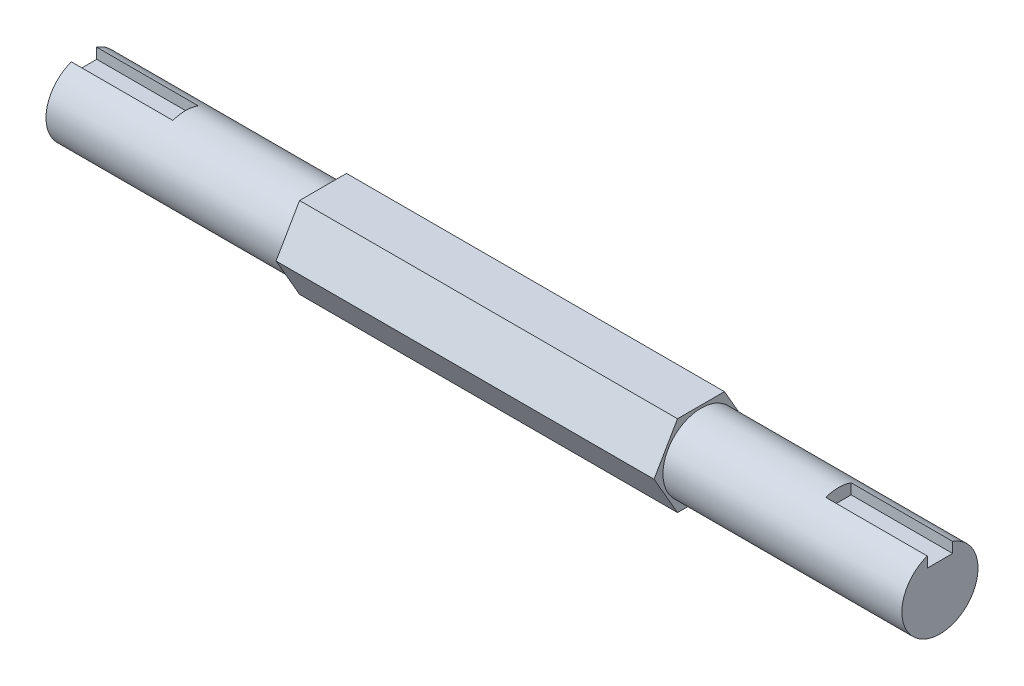
ISO-10303-21;
HEADER;
FILE_DESCRIPTION(('STEP AP214'),'2;1');
FILE_NAME('part.step','',(''),(''),'','','');
FILE_SCHEMA(('AUTOMOTIVE_DESIGN { 1 0 10303 214 1 1 1 1 }'));
ENDSEC;
DATA;
#1=APPLICATION_CONTEXT('core data for automotive mechanical design processes');
#2=APPLICATION_PROTOCOL_DEFINITION('international standard','automotive_design',2000,#1);
#3=PRODUCT_CONTEXT('',#1,'mechanical');
#4=PRODUCT('Part','Part','',(#3));
#5=PRODUCT_RELATED_PRODUCT_CATEGORY('part','',(#4));
#6=PRODUCT_DEFINITION_FORMATION('','',#4);
#7=PRODUCT_DEFINITION_CONTEXT('part definition',#1,'design');
#8=PRODUCT_DEFINITION('design','',#6,#7);
#9=PRODUCT_DEFINITION_SHAPE('','',#8);
#10=(LENGTH_UNIT() NAMED_UNIT(*) SI_UNIT(.MILLI.,.METRE.));
#11=(NAMED_UNIT(*) PLANE_ANGLE_UNIT() SI_UNIT($,.RADIAN.));
#12=(NAMED_UNIT(*) SI_UNIT($,.STERADIAN.) SOLID_ANGLE_UNIT());
#13=UNCERTAINTY_MEASURE_WITH_UNIT(LENGTH_MEASURE(1.E-05),#10,'distance_accuracy_value','');
#14=(GEOMETRIC_REPRESENTATION_CONTEXT(3) GLOBAL_UNCERTAINTY_ASSIGNED_CONTEXT((#13)) GLOBAL_UNIT_ASSIGNED_CONTEXT((#10,
#11,#12)) REPRESENTATION_CONTEXT('',''));
#15=CARTESIAN_POINT('',(0.,0.,0.));
#16=DIRECTION('',(0.,0.,1.));
#17=DIRECTION('',(1.,0.,0.));
#18=AXIS2_PLACEMENT_3D('',#15,#16,#17);
#19=CARTESIAN_POINT('',(-168.7,0.,0.));
#20=DIRECTION('',(1.,0.,0.));
#21=DIRECTION('',(0.,0.,-1.));
#22=AXIS2_PLACEMENT_3D('',#19,#20,#21);
#23=PLANE('',#22);
#24=DIRECTION('',(0.,1.,0.));
#25=VECTOR('',#24,1.);
#26=CARTESIAN_POINT('',(-168.7,10.,-5.));
#27=LINE('',#26,#25);
#28=CARTESIAN_POINT('',(-168.7,10.,-5.));
#29=VERTEX_POINT('',#28);
#30=CARTESIAN_POINT('',(-168.7,14.142135623731,-5.));
#31=VERTEX_POINT('',#30);
#32=EDGE_CURVE('E148',#29,#31,#27,.T.);
#33=ORIENTED_EDGE('',*,*,#32,.T.);
#34=CARTESIAN_POINT('',(-168.7,0.,0.));
#35=DIRECTION('',(1.,0.,0.));
#36=DIRECTION('',(0.,0.,-1.));
#37=AXIS2_PLACEMENT_3D('',#34,#35,#36);
#38=CIRCLE('',#37,15.);
#39=CARTESIAN_POINT('',(-168.7,14.142135623731,5.));
#40=VERTEX_POINT('',#39);
#41=EDGE_CURVE('E235',#40,#31,#38,.T.);
#42=ORIENTED_EDGE('',*,*,#41,.F.);
#43=DIRECTION('',(0.,-1.,0.));
#44=VECTOR('',#43,1.);
#45=CARTESIAN_POINT('',(-168.7,10.,5.));
#46=LINE('',#45,#44);
#47=CARTESIAN_POINT('',(-168.7,10.,5.));
#48=VERTEX_POINT('',#47);
#49=EDGE_CURVE('E154',#40,#48,#46,.T.);
#50=ORIENTED_EDGE('',*,*,#49,.T.);
#51=DIRECTION('',(0.,0.,-1.));
#52=VECTOR('',#51,1.);
#53=CARTESIAN_POINT('',(-168.7,10.,5.));
#54=LINE('',#53,#52);
#55=EDGE_CURVE('E157',#48,#29,#54,.T.);
#56=ORIENTED_EDGE('',*,*,#55,.T.);
#57=EDGE_LOOP('',(#33,#42,#50,#56));
#58=FACE_BOUND('',#57,.T.);
#59=ADVANCED_FACE('F33',(#58),#23,.F.);
#60=CARTESIAN_POINT('',(168.7,0.,0.));
#61=DIRECTION('',(-1.,0.,0.));
#62=DIRECTION('',(0.,0.,1.));
#63=AXIS2_PLACEMENT_3D('',#60,#61,#62);
#64=CYLINDRICAL_SURFACE('',#63,15.);
#65=CARTESIAN_POINT('',(-74.5,0.,0.));
#66=DIRECTION('',(1.,0.,0.));
#67=DIRECTION('',(0.,0.,-1.));
#68=AXIS2_PLACEMENT_3D('',#65,#66,#67);
#69=CIRCLE('',#68,15.);
#70=CARTESIAN_POINT('',(-74.5,0.,-15.));
#71=VERTEX_POINT('',#70);
#72=EDGE_CURVE('E234',#71,#71,#69,.T.);
#73=ORIENTED_EDGE('',*,*,#72,.F.);
#74=EDGE_LOOP('',(#73));
#75=FACE_BOUND('',#74,.T.);
#76=DIRECTION('',(-1.,0.,0.));
#77=VECTOR('',#76,1.);
#78=CARTESIAN_POINT('',(168.7,14.142135623731,-5.));
#79=LINE('',#78,#77);
#80=CARTESIAN_POINT('',(-128.7,14.142135623731,-5.));
#81=VERTEX_POINT('',#80);
#82=EDGE_CURVE('E11',#81,#31,#79,.T.);
#83=ORIENTED_EDGE('',*,*,#82,.F.);
#84=CARTESIAN_POINT('',(-128.7,0.,0.));
#85=DIRECTION('',(1.,0.,0.));
#86=DIRECTION('',(0.,0.,-1.));
#87=AXIS2_PLACEMENT_3D('',#84,#85,#86);
#88=CIRCLE('',#87,15.);
#89=CARTESIAN_POINT('',(-128.7,14.142135623731,5.));
#90=VERTEX_POINT('',#89);
#91=EDGE_CURVE('E153',#81,#90,#88,.T.);
#92=ORIENTED_EDGE('',*,*,#91,.T.);
#93=DIRECTION('',(-1.,0.,0.));
#94=VECTOR('',#93,1.);
#95=CARTESIAN_POINT('',(168.7,14.142135623731,5.));
#96=LINE('',#95,#94);
#97=EDGE_CURVE('E41',#40,#90,#96,.F.);
#98=ORIENTED_EDGE('',*,*,#97,.F.);
#99=ORIENTED_EDGE('',*,*,#41,.T.);
#100=EDGE_LOOP('',(#83,#92,#98,#99));
#101=FACE_BOUND('',#100,.T.);
#102=ADVANCED_FACE('F252',(#75,#101),#64,.T.);
#103=CARTESIAN_POINT('',(74.5,0.,0.));
#104=DIRECTION('',(1.,0.,0.));
#105=DIRECTION('',(0.,0.,-1.));
#106=AXIS2_PLACEMENT_3D('',#103,#104,#105);
#107=CIRCLE('',#106,15.);
#108=CARTESIAN_POINT('',(74.5,0.,-15.));
#109=VERTEX_POINT('',#108);
#110=EDGE_CURVE('E230',#109,#109,#107,.T.);
#111=ORIENTED_EDGE('',*,*,#110,.T.);
#112=EDGE_LOOP('',(#111));
#113=FACE_BOUND('',#112,.T.);
#114=CARTESIAN_POINT('',(128.7,0.,0.));
#115=DIRECTION('',(-1.,0.,0.));
#116=DIRECTION('',(0.,0.,1.));
#117=AXIS2_PLACEMENT_3D('',#114,#115,#116);
#118=CIRCLE('',#117,15.);
#119=CARTESIAN_POINT('',(128.7,14.142135623731,5.));
#120=VERTEX_POINT('',#119);
#121=CARTESIAN_POINT('',(128.7,14.142135623731,-5.));
#122=VERTEX_POINT('',#121);
#123=EDGE_CURVE('E244',#120,#122,#118,.T.);
#124=ORIENTED_EDGE('',*,*,#123,.T.);
#125=DIRECTION('',(-1.,0.,0.));
#126=VECTOR('',#125,1.);
#127=CARTESIAN_POINT('',(168.7,14.142135623731,-5.));
#128=LINE('',#127,#126);
#129=CARTESIAN_POINT('',(168.7,14.142135623731,-5.));
#130=VERTEX_POINT('',#129);
#131=EDGE_CURVE('E183',#122,#130,#128,.F.);
#132=ORIENTED_EDGE('',*,*,#131,.T.);
#133=CARTESIAN_POINT('',(168.7,0.,0.));
#134=DIRECTION('',(1.,0.,0.));
#135=DIRECTION('',(0.,0.,-1.));
#136=AXIS2_PLACEMENT_3D('',#133,#134,#135);
#137=CIRCLE('',#136,15.);
#138=CARTESIAN_POINT('',(168.7,14.142135623731,5.));
#139=VERTEX_POINT('',#138);
#140=EDGE_CURVE('E231',#139,#130,#137,.T.);
#141=ORIENTED_EDGE('',*,*,#140,.F.);
#142=DIRECTION('',(-1.,0.,0.));
#143=VECTOR('',#142,1.);
#144=CARTESIAN_POINT('',(168.7,14.142135623731,5.));
#145=LINE('',#144,#143);
#146=EDGE_CURVE('E56',#139,#120,#145,.T.);
#147=ORIENTED_EDGE('',*,*,#146,.T.);
#148=EDGE_LOOP('',(#124,#132,#141,#147));
#149=FACE_BOUND('',#148,.T.);
#150=ADVANCED_FACE('F35',(#113,#149),#64,.T.);
#151=CARTESIAN_POINT('',(168.7,0.,0.));
#152=DIRECTION('',(1.,0.,0.));
#153=DIRECTION('',(0.,0.,-1.));
#154=AXIS2_PLACEMENT_3D('',#151,#152,#153);
#155=PLANE('',#154);
#156=DIRECTION('',(0.,1.,0.));
#157=VECTOR('',#156,1.);
#158=CARTESIAN_POINT('',(168.7,10.,-5.));
#159=LINE('',#158,#157);
#160=CARTESIAN_POINT('',(168.7,10.,-5.));
#161=VERTEX_POINT('',#160);
#162=EDGE_CURVE('E163',#161,#130,#159,.T.);
#163=ORIENTED_EDGE('',*,*,#162,.F.);
#164=DIRECTION('',(0.,0.,-1.));
#165=VECTOR('',#164,1.);
#166=CARTESIAN_POINT('',(168.7,10.,5.));
#167=LINE('',#166,#165);
#168=CARTESIAN_POINT('',(168.7,10.,5.));
#169=VERTEX_POINT('',#168);
#170=EDGE_CURVE('E169',#169,#161,#167,.T.);
#171=ORIENTED_EDGE('',*,*,#170,.F.);
#172=DIRECTION('',(0.,-1.,0.));
#173=VECTOR('',#172,1.);
#174=CARTESIAN_POINT('',(168.7,0.,5.));
#175=LINE('',#174,#173);
#176=EDGE_CURVE('E240',#139,#169,#175,.T.);
#177=ORIENTED_EDGE('',*,*,#176,.F.);
#178=ORIENTED_EDGE('',*,*,#140,.T.);
#179=EDGE_LOOP('',(#163,#171,#177,#178));
#180=FACE_BOUND('',#179,.T.);
#181=ADVANCED_FACE('F260',(#180),#155,.T.);
#182=CARTESIAN_POINT('',(74.5,16.025,9.25203806376373));
#183=DIRECTION('',(0.,-0.5,-0.866025403784439));
#184=DIRECTION('',(0.,0.866025403784439,-0.5));
#185=AXIS2_PLACEMENT_3D('',#182,#183,#184);
#186=PLANE('',#185);
#187=DIRECTION('',(0.,-0.866025403784439,0.5));
#188=VECTOR('',#187,1.);
#189=CARTESIAN_POINT('',(-74.5,16.025,9.25203806376373));
#190=LINE('',#189,#188);
#191=CARTESIAN_POINT('',(-74.5,16.025,9.25203806376373));
#192=VERTEX_POINT('',#191);
#193=CARTESIAN_POINT('',(-74.5,0.,18.5040761275275));
#194=VERTEX_POINT('',#193);
#195=EDGE_CURVE('E186',#192,#194,#190,.T.);
#196=ORIENTED_EDGE('',*,*,#195,.T.);
#197=DIRECTION('',(-1.,0.,0.));
#198=VECTOR('',#197,1.);
#199=CARTESIAN_POINT('',(74.5,0.,18.5040761275275));
#200=LINE('',#199,#198);
#201=CARTESIAN_POINT('',(74.5,0.,18.5040761275275));
#202=VERTEX_POINT('',#201);
#203=EDGE_CURVE('E227',#202,#194,#200,.T.);
#204=ORIENTED_EDGE('',*,*,#203,.F.);
#205=DIRECTION('',(0.,-0.866025403784439,0.5));
#206=VECTOR('',#205,1.);
#207=CARTESIAN_POINT('',(74.5,16.025,9.25203806376373));
#208=LINE('',#207,#206);
#209=CARTESIAN_POINT('',(74.5,16.025,9.25203806376373));
#210=VERTEX_POINT('',#209);
#211=EDGE_CURVE('E187',#210,#202,#208,.T.);
#212=ORIENTED_EDGE('',*,*,#211,.F.);
#213=DIRECTION('',(-1.,0.,0.));
#214=VECTOR('',#213,1.);
#215=CARTESIAN_POINT('',(74.5,16.025,9.25203806376373));
#216=LINE('',#215,#214);
#217=EDGE_CURVE('E201',#210,#192,#216,.T.);
#218=ORIENTED_EDGE('',*,*,#217,.T.);
#219=EDGE_LOOP('',(#196,#204,#212,#218));
#220=FACE_BOUND('',#219,.T.);
#221=ADVANCED_FACE('F263',(#220),#186,.F.);
#222=CARTESIAN_POINT('',(74.5,0.,18.5040761275275));
#223=DIRECTION('',(0.,0.5,-0.866025403784439));
#224=DIRECTION('',(0.,0.866025403784439,0.5));
#225=AXIS2_PLACEMENT_3D('',#222,#223,#224);
#226=PLANE('',#225);
#227=DIRECTION('',(0.,-0.866025403784439,-0.5));
#228=VECTOR('',#227,1.);
#229=CARTESIAN_POINT('',(-74.5,0.,18.5040761275275));
#230=LINE('',#229,#228);
#231=CARTESIAN_POINT('',(-74.5,-16.025,9.25203806376375));
#232=VERTEX_POINT('',#231);
#233=EDGE_CURVE('E204',#194,#232,#230,.T.);
#234=ORIENTED_EDGE('',*,*,#233,.T.);
#235=DIRECTION('',(-1.,0.,0.));
#236=VECTOR('',#235,1.);
#237=CARTESIAN_POINT('',(74.5,-16.025,9.25203806376375));
#238=LINE('',#237,#236);
#239=CARTESIAN_POINT('',(74.5,-16.025,9.25203806376375));
#240=VERTEX_POINT('',#239);
#241=EDGE_CURVE('E224',#240,#232,#238,.T.);
#242=ORIENTED_EDGE('',*,*,#241,.F.);
#243=DIRECTION('',(0.,-0.866025403784439,-0.5));
#244=VECTOR('',#243,1.);
#245=CARTESIAN_POINT('',(74.5,0.,18.5040761275275));
#246=LINE('',#245,#244);
#247=EDGE_CURVE('E190',#202,#240,#246,.T.);
#248=ORIENTED_EDGE('',*,*,#247,.F.);
#249=ORIENTED_EDGE('',*,*,#203,.T.);
#250=EDGE_LOOP('',(#234,#242,#248,#249));
#251=FACE_BOUND('',#250,.T.);
#252=ADVANCED_FACE('F267',(#251),#226,.F.);
#253=CARTESIAN_POINT('',(74.5,-16.025,9.25203806376375));
#254=DIRECTION('',(0.,1.,0.));
#255=DIRECTION('',(0.,0.,1.));
#256=AXIS2_PLACEMENT_3D('',#253,#254,#255);
#257=PLANE('',#256);
#258=DIRECTION('',(0.,0.,-1.));
#259=VECTOR('',#258,1.);
#260=CARTESIAN_POINT('',(-74.5,-16.025,9.25203806376375));
#261=LINE('',#260,#259);
#262=CARTESIAN_POINT('',(-74.5,-16.025,-9.25203806376375));
#263=VERTEX_POINT('',#262);
#264=EDGE_CURVE('E206',#232,#263,#261,.T.);
#265=ORIENTED_EDGE('',*,*,#264,.T.);
#266=DIRECTION('',(-1.,0.,0.));
#267=VECTOR('',#266,1.);
#268=CARTESIAN_POINT('',(74.5,-16.025,-9.25203806376375));
#269=LINE('',#268,#267);
#270=CARTESIAN_POINT('',(74.5,-16.025,-9.25203806376375));
#271=VERTEX_POINT('',#270);
#272=EDGE_CURVE('E221',#271,#263,#269,.T.);
#273=ORIENTED_EDGE('',*,*,#272,.F.);
#274=DIRECTION('',(0.,0.,-1.));
#275=VECTOR('',#274,1.);
#276=CARTESIAN_POINT('',(74.5,-16.025,9.25203806376375));
#277=LINE('',#276,#275);
#278=EDGE_CURVE('E193',#240,#271,#277,.T.);
#279=ORIENTED_EDGE('',*,*,#278,.F.);
#280=ORIENTED_EDGE('',*,*,#241,.T.);
#281=EDGE_LOOP('',(#265,#273,#279,#280));
#282=FACE_BOUND('',#281,.T.);
#283=ADVANCED_FACE('F271',(#282),#257,.F.);
#284=CARTESIAN_POINT('',(74.5,-16.025,-9.25203806376375));
#285=DIRECTION('',(0.,0.5,0.866025403784439));
#286=DIRECTION('',(0.,-0.866025403784439,0.5));
#287=AXIS2_PLACEMENT_3D('',#284,#285,#286);
#288=PLANE('',#287);
#289=DIRECTION('',(0.,0.866025403784439,-0.5));
#290=VECTOR('',#289,1.);
#291=CARTESIAN_POINT('',(-74.5,-16.025,-9.25203806376375));
#292=LINE('',#291,#290);
#293=CARTESIAN_POINT('',(-74.5,0.,-18.5040761275275));
#294=VERTEX_POINT('',#293);
#295=EDGE_CURVE('E208',#263,#294,#292,.T.);
#296=ORIENTED_EDGE('',*,*,#295,.T.);
#297=DIRECTION('',(-1.,0.,0.));
#298=VECTOR('',#297,1.);
#299=CARTESIAN_POINT('',(74.5,0.,-18.5040761275275));
#300=LINE('',#299,#298);
#301=CARTESIAN_POINT('',(74.5,0.,-18.5040761275275));
#302=VERTEX_POINT('',#301);
#303=EDGE_CURVE('E218',#302,#294,#300,.T.);
#304=ORIENTED_EDGE('',*,*,#303,.F.);
#305=DIRECTION('',(0.,0.866025403784439,-0.5));
#306=VECTOR('',#305,1.);
#307=CARTESIAN_POINT('',(74.5,-16.025,-9.25203806376375));
#308=LINE('',#307,#306);
#309=EDGE_CURVE('E195',#271,#302,#308,.T.);
#310=ORIENTED_EDGE('',*,*,#309,.F.);
#311=ORIENTED_EDGE('',*,*,#272,.T.);
#312=EDGE_LOOP('',(#296,#304,#310,#311));
#313=FACE_BOUND('',#312,.T.);
#314=ADVANCED_FACE('F275',(#313),#288,.F.);
#315=CARTESIAN_POINT('',(74.5,0.,-18.5040761275275));
#316=DIRECTION('',(0.,-0.5,0.866025403784439));
#317=DIRECTION('',(0.,-0.866025403784439,-0.5));
#318=AXIS2_PLACEMENT_3D('',#315,#316,#317);
#319=PLANE('',#318);
#320=DIRECTION('',(0.,0.866025403784439,0.5));
#321=VECTOR('',#320,1.);
#322=CARTESIAN_POINT('',(-74.5,0.,-18.5040761275275));
#323=LINE('',#322,#321);
#324=CARTESIAN_POINT('',(-74.5,16.025,-9.25203806376374));
#325=VERTEX_POINT('',#324);
#326=EDGE_CURVE('E210',#294,#325,#323,.T.);
#327=ORIENTED_EDGE('',*,*,#326,.T.);
#328=DIRECTION('',(-1.,0.,0.));
#329=VECTOR('',#328,1.);
#330=CARTESIAN_POINT('',(74.5,16.025,-9.25203806376374));
#331=LINE('',#330,#329);
#332=CARTESIAN_POINT('',(74.5,16.025,-9.25203806376374));
#333=VERTEX_POINT('',#332);
#334=EDGE_CURVE('E215',#333,#325,#331,.T.);
#335=ORIENTED_EDGE('',*,*,#334,.F.);
#336=DIRECTION('',(0.,0.866025403784439,0.5));
#337=VECTOR('',#336,1.);
#338=CARTESIAN_POINT('',(74.5,0.,-18.5040761275275));
#339=LINE('',#338,#337);
#340=EDGE_CURVE('E197',#302,#333,#339,.T.);
#341=ORIENTED_EDGE('',*,*,#340,.F.);
#342=ORIENTED_EDGE('',*,*,#303,.T.);
#343=EDGE_LOOP('',(#327,#335,#341,#342));
#344=FACE_BOUND('',#343,.T.);
#345=ADVANCED_FACE('F279',(#344),#319,.F.);
#346=CARTESIAN_POINT('',(74.5,16.025,-9.25203806376374));
#347=DIRECTION('',(0.,-1.,0.));
#348=DIRECTION('',(0.,0.,-1.));
#349=AXIS2_PLACEMENT_3D('',#346,#347,#348);
#350=PLANE('',#349);
#351=DIRECTION('',(0.,0.,1.));
#352=VECTOR('',#351,1.);
#353=CARTESIAN_POINT('',(-74.5,16.025,-9.25203806376374));
#354=LINE('',#353,#352);
#355=EDGE_CURVE('E191',#325,#192,#354,.T.);
#356=ORIENTED_EDGE('',*,*,#355,.T.);
#357=ORIENTED_EDGE('',*,*,#217,.F.);
#358=DIRECTION('',(0.,0.,1.));
#359=VECTOR('',#358,1.);
#360=CARTESIAN_POINT('',(74.5,16.025,-9.25203806376374));
#361=LINE('',#360,#359);
#362=EDGE_CURVE('E199',#333,#210,#361,.T.);
#363=ORIENTED_EDGE('',*,*,#362,.F.);
#364=ORIENTED_EDGE('',*,*,#334,.T.);
#365=EDGE_LOOP('',(#356,#357,#363,#364));
#366=FACE_BOUND('',#365,.T.);
#367=ADVANCED_FACE('F283',(#366),#350,.F.);
#368=CARTESIAN_POINT('',(74.5,0.,0.));
#369=DIRECTION('',(1.,0.,0.));
#370=DIRECTION('',(0.,0.,-1.));
#371=AXIS2_PLACEMENT_3D('',#368,#369,#370);
#372=PLANE('',#371);
#373=ORIENTED_EDGE('',*,*,#110,.F.);
#374=EDGE_LOOP('',(#373));
#375=FACE_BOUND('',#374,.T.);
#376=ORIENTED_EDGE('',*,*,#211,.T.);
#377=ORIENTED_EDGE('',*,*,#247,.T.);
#378=ORIENTED_EDGE('',*,*,#278,.T.);
#379=ORIENTED_EDGE('',*,*,#309,.T.);
#380=ORIENTED_EDGE('',*,*,#340,.T.);
#381=ORIENTED_EDGE('',*,*,#362,.T.);
#382=EDGE_LOOP('',(#376,#377,#378,#379,#380,#381));
#383=FACE_BOUND('',#382,.T.);
#384=ADVANCED_FACE('F287',(#375,#383),#372,.T.);
#385=CARTESIAN_POINT('',(-74.5,0.,0.));
#386=DIRECTION('',(1.,0.,0.));
#387=DIRECTION('',(0.,0.,-1.));
#388=AXIS2_PLACEMENT_3D('',#385,#386,#387);
#389=PLANE('',#388);
#390=ORIENTED_EDGE('',*,*,#72,.T.);
#391=EDGE_LOOP('',(#390));
#392=FACE_BOUND('',#391,.T.);
#393=ORIENTED_EDGE('',*,*,#195,.F.);
#394=ORIENTED_EDGE('',*,*,#355,.F.);
#395=ORIENTED_EDGE('',*,*,#326,.F.);
#396=ORIENTED_EDGE('',*,*,#295,.F.);
#397=ORIENTED_EDGE('',*,*,#264,.F.);
#398=ORIENTED_EDGE('',*,*,#233,.F.);
#399=EDGE_LOOP('',(#393,#394,#395,#396,#397,#398));
#400=FACE_BOUND('',#399,.T.);
#401=ADVANCED_FACE('F289',(#392,#400),#389,.F.);
#402=CARTESIAN_POINT('',(128.7,0.,0.));
#403=DIRECTION('',(-1.,0.,0.));
#404=DIRECTION('',(0.,0.,1.));
#405=AXIS2_PLACEMENT_3D('',#402,#403,#404);
#406=PLANE('',#405);
#407=DIRECTION('',(0.,-1.,0.));
#408=VECTOR('',#407,1.);
#409=CARTESIAN_POINT('',(128.7,10.,5.));
#410=LINE('',#409,#408);
#411=CARTESIAN_POINT('',(128.7,10.,5.));
#412=VERTEX_POINT('',#411);
#413=EDGE_CURVE('E168',#120,#412,#410,.T.);
#414=ORIENTED_EDGE('',*,*,#413,.T.);
#415=DIRECTION('',(0.,0.,-1.));
#416=VECTOR('',#415,1.);
#417=CARTESIAN_POINT('',(128.7,10.,5.));
#418=LINE('',#417,#416);
#419=CARTESIAN_POINT('',(128.7,10.,-5.));
#420=VERTEX_POINT('',#419);
#421=EDGE_CURVE('E171',#412,#420,#418,.T.);
#422=ORIENTED_EDGE('',*,*,#421,.T.);
#423=DIRECTION('',(0.,1.,0.));
#424=VECTOR('',#423,1.);
#425=CARTESIAN_POINT('',(128.7,10.,-5.));
#426=LINE('',#425,#424);
#427=EDGE_CURVE('E165',#420,#122,#426,.T.);
#428=ORIENTED_EDGE('',*,*,#427,.T.);
#429=ORIENTED_EDGE('',*,*,#123,.F.);
#430=EDGE_LOOP('',(#414,#422,#428,#429));
#431=FACE_BOUND('',#430,.T.);
#432=ADVANCED_FACE('F292',(#431),#406,.F.);
#433=CARTESIAN_POINT('',(128.7,10.,-5.));
#434=DIRECTION('',(0.,0.,-1.));
#435=DIRECTION('',(-1.,0.,0.));
#436=AXIS2_PLACEMENT_3D('',#433,#434,#435);
#437=PLANE('',#436);
#438=ORIENTED_EDGE('',*,*,#427,.F.);
#439=DIRECTION('',(1.,0.,0.));
#440=VECTOR('',#439,1.);
#441=CARTESIAN_POINT('',(128.7,10.,-5.));
#442=LINE('',#441,#440);
#443=EDGE_CURVE('E178',#420,#161,#442,.T.);
#444=ORIENTED_EDGE('',*,*,#443,.T.);
#445=ORIENTED_EDGE('',*,*,#162,.T.);
#446=ORIENTED_EDGE('',*,*,#131,.F.);
#447=EDGE_LOOP('',(#438,#444,#445,#446));
#448=FACE_BOUND('',#447,.T.);
#449=ADVANCED_FACE('F297',(#448),#437,.F.);
#450=CARTESIAN_POINT('',(128.7,10.,5.));
#451=DIRECTION('',(0.,0.,1.));
#452=DIRECTION('',(1.,0.,0.));
#453=AXIS2_PLACEMENT_3D('',#450,#451,#452);
#454=PLANE('',#453);
#455=ORIENTED_EDGE('',*,*,#176,.T.);
#456=DIRECTION('',(1.,0.,0.));
#457=VECTOR('',#456,1.);
#458=CARTESIAN_POINT('',(128.7,10.,5.));
#459=LINE('',#458,#457);
#460=EDGE_CURVE('E174',#412,#169,#459,.T.);
#461=ORIENTED_EDGE('',*,*,#460,.F.);
#462=ORIENTED_EDGE('',*,*,#413,.F.);
#463=ORIENTED_EDGE('',*,*,#146,.F.);
#464=EDGE_LOOP('',(#455,#461,#462,#463));
#465=FACE_BOUND('',#464,.T.);
#466=ADVANCED_FACE('F300',(#465),#454,.F.);
#467=CARTESIAN_POINT('',(128.7,10.,5.));
#468=DIRECTION('',(0.,-1.,0.));
#469=DIRECTION('',(0.,0.,-1.));
#470=AXIS2_PLACEMENT_3D('',#467,#468,#469);
#471=PLANE('',#470);
#472=ORIENTED_EDGE('',*,*,#170,.T.);
#473=ORIENTED_EDGE('',*,*,#443,.F.);
#474=ORIENTED_EDGE('',*,*,#421,.F.);
#475=ORIENTED_EDGE('',*,*,#460,.T.);
#476=EDGE_LOOP('',(#472,#473,#474,#475));
#477=FACE_BOUND('',#476,.T.);
#478=ADVANCED_FACE('F304',(#477),#471,.F.);
#479=CARTESIAN_POINT('',(-128.7,10.,-5.));
#480=DIRECTION('',(0.,0.,1.));
#481=DIRECTION('',(1.,0.,0.));
#482=AXIS2_PLACEMENT_3D('',#479,#480,#481);
#483=PLANE('',#482);
#484=ORIENTED_EDGE('',*,*,#82,.T.);
#485=ORIENTED_EDGE('',*,*,#32,.F.);
#486=DIRECTION('',(-1.,0.,0.));
#487=VECTOR('',#486,1.);
#488=CARTESIAN_POINT('',(-128.7,10.,-5.));
#489=LINE('',#488,#487);
#490=CARTESIAN_POINT('',(-128.7,10.,-5.));
#491=VERTEX_POINT('',#490);
#492=EDGE_CURVE('E137',#491,#29,#489,.T.);
#493=ORIENTED_EDGE('',*,*,#492,.F.);
#494=DIRECTION('',(0.,1.,0.));
#495=VECTOR('',#494,1.);
#496=CARTESIAN_POINT('',(-128.7,10.,-5.));
#497=LINE('',#496,#495);
#498=EDGE_CURVE('E141',#491,#81,#497,.T.);
#499=ORIENTED_EDGE('',*,*,#498,.T.);
#500=EDGE_LOOP('',(#484,#485,#493,#499));
#501=FACE_BOUND('',#500,.T.);
#502=ADVANCED_FACE('F145',(#501),#483,.T.);
#503=CARTESIAN_POINT('',(-128.7,10.,5.));
#504=DIRECTION('',(0.,0.,-1.));
#505=DIRECTION('',(-1.,0.,0.));
#506=AXIS2_PLACEMENT_3D('',#503,#504,#505);
#507=PLANE('',#506);
#508=ORIENTED_EDGE('',*,*,#97,.T.);
#509=DIRECTION('',(0.,-1.,0.));
#510=VECTOR('',#509,1.);
#511=CARTESIAN_POINT('',(-128.7,10.,5.));
#512=LINE('',#511,#510);
#513=CARTESIAN_POINT('',(-128.7,10.,5.));
#514=VERTEX_POINT('',#513);
#515=EDGE_CURVE('E48',#90,#514,#512,.T.);
#516=ORIENTED_EDGE('',*,*,#515,.T.);
#517=DIRECTION('',(-1.,0.,0.));
#518=VECTOR('',#517,1.);
#519=CARTESIAN_POINT('',(-128.7,10.,5.));
#520=LINE('',#519,#518);
#521=EDGE_CURVE('E139',#514,#48,#520,.T.);
#522=ORIENTED_EDGE('',*,*,#521,.T.);
#523=ORIENTED_EDGE('',*,*,#49,.F.);
#524=EDGE_LOOP('',(#508,#516,#522,#523));
#525=FACE_BOUND('',#524,.T.);
#526=ADVANCED_FACE('F249',(#525),#507,.T.);
#527=CARTESIAN_POINT('',(-128.7,0.,0.));
#528=DIRECTION('',(1.,0.,0.));
#529=DIRECTION('',(0.,0.,1.));
#530=AXIS2_PLACEMENT_3D('',#527,#528,#529);
#531=PLANE('',#530);
#532=ORIENTED_EDGE('',*,*,#498,.F.);
#533=DIRECTION('',(0.,0.,-1.));
#534=VECTOR('',#533,1.);
#535=CARTESIAN_POINT('',(-128.7,10.,5.));
#536=LINE('',#535,#534);
#537=EDGE_CURVE('E133',#514,#491,#536,.T.);
#538=ORIENTED_EDGE('',*,*,#537,.F.);
#539=ORIENTED_EDGE('',*,*,#515,.F.);
#540=ORIENTED_EDGE('',*,*,#91,.F.);
#541=EDGE_LOOP('',(#532,#538,#539,#540));
#542=FACE_BOUND('',#541,.T.);
#543=ADVANCED_FACE('F151',(#542),#531,.F.);
#544=CARTESIAN_POINT('',(-128.7,10.,5.));
#545=DIRECTION('',(0.,1.,0.));
#546=DIRECTION('',(0.,0.,1.));
#547=AXIS2_PLACEMENT_3D('',#544,#545,#546);
#548=PLANE('',#547);
#549=ORIENTED_EDGE('',*,*,#55,.F.);
#550=ORIENTED_EDGE('',*,*,#521,.F.);
#551=ORIENTED_EDGE('',*,*,#537,.T.);
#552=ORIENTED_EDGE('',*,*,#492,.T.);
#553=EDGE_LOOP('',(#549,#550,#551,#552));
#554=FACE_BOUND('',#553,.T.);
#555=ADVANCED_FACE('F136',(#554),#548,.T.);
#556=CLOSED_SHELL('',(#59,#102,#150,#181,#221,#252,#283,#314,#345,#367,#384,#401,#432,#449,#466,
#478,#502,#526,#543,#555));
#557=MANIFOLD_SOLID_BREP('B2',#556);
#558=ADVANCED_BREP_SHAPE_REPRESENTATION('',(#18,#557),#14);
#559=SHAPE_DEFINITION_REPRESENTATION(#9,#558);
ENDSEC;
END-ISO-10303-21;
